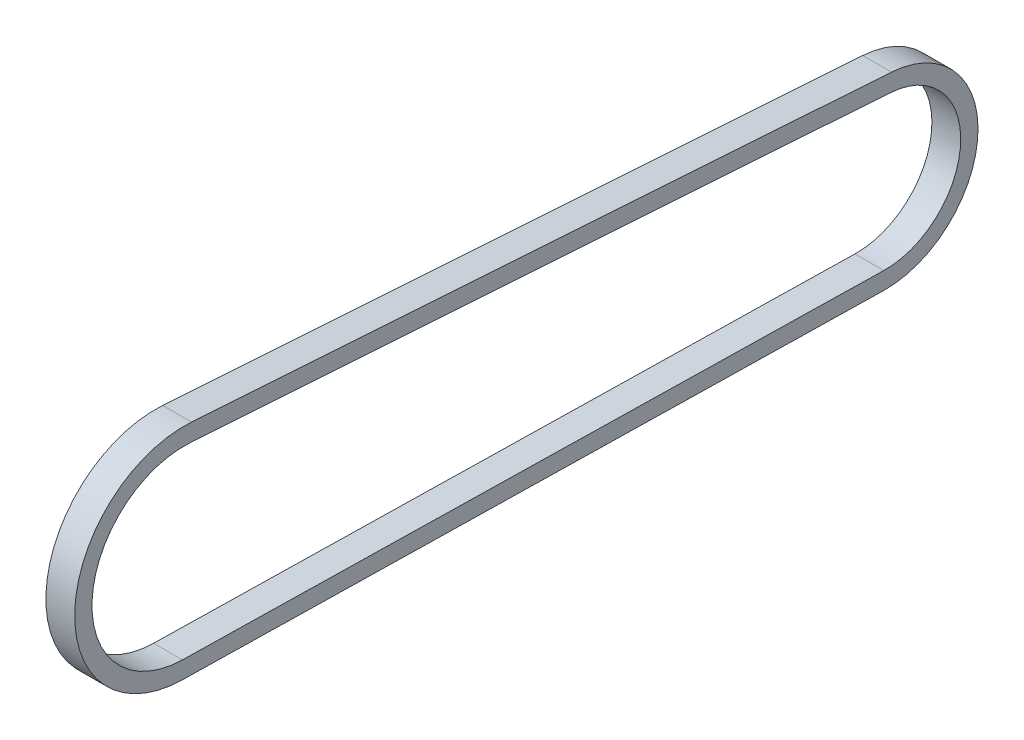
ISO-10303-21;
HEADER;
FILE_DESCRIPTION(('STEP AP214'),'2;1');
FILE_NAME('part.step','',(''),(''),'','','');
FILE_SCHEMA(('AUTOMOTIVE_DESIGN { 1 0 10303 214 1 1 1 1 }'));
ENDSEC;
DATA;
#1=APPLICATION_CONTEXT('core data for automotive mechanical design processes');
#2=APPLICATION_PROTOCOL_DEFINITION('international standard','automotive_design',2000,#1);
#3=PRODUCT_CONTEXT('',#1,'mechanical');
#4=PRODUCT('Part','Part','',(#3));
#5=PRODUCT_RELATED_PRODUCT_CATEGORY('part','',(#4));
#6=PRODUCT_DEFINITION_FORMATION('','',#4);
#7=PRODUCT_DEFINITION_CONTEXT('part definition',#1,'design');
#8=PRODUCT_DEFINITION('design','',#6,#7);
#9=PRODUCT_DEFINITION_SHAPE('','',#8);
#10=(LENGTH_UNIT() NAMED_UNIT(*) SI_UNIT(.MILLI.,.METRE.));
#11=(NAMED_UNIT(*) PLANE_ANGLE_UNIT() SI_UNIT($,.RADIAN.));
#12=(NAMED_UNIT(*) SI_UNIT($,.STERADIAN.) SOLID_ANGLE_UNIT());
#13=UNCERTAINTY_MEASURE_WITH_UNIT(LENGTH_MEASURE(1.E-05),#10,'distance_accuracy_value','');
#14=(GEOMETRIC_REPRESENTATION_CONTEXT(3) GLOBAL_UNCERTAINTY_ASSIGNED_CONTEXT((#13)) GLOBAL_UNIT_ASSIGNED_CONTEXT((#10,
#11,#12)) REPRESENTATION_CONTEXT('',''));
#15=CARTESIAN_POINT('',(0.,0.,0.));
#16=DIRECTION('',(0.,0.,1.));
#17=DIRECTION('',(1.,0.,0.));
#18=AXIS2_PLACEMENT_3D('',#15,#16,#17);
#19=CARTESIAN_POINT('',(68.5,21.,108.369459277537));
#20=DIRECTION('',(1.,0.,0.));
#21=DIRECTION('',(0.,0.,-1.));
#22=AXIS2_PLACEMENT_3D('',#19,#20,#21);
#23=PLANE('',#22);
#24=CARTESIAN_POINT('',(68.5,21.,108.369459277537));
#25=DIRECTION('',(1.,0.,0.));
#26=DIRECTION('',(0.,0.,-1.));
#27=AXIS2_PLACEMENT_3D('',#24,#25,#26);
#28=CIRCLE('',#27,15.204);
#29=CARTESIAN_POINT('',(68.5,36.169921825998,107.352066633024));
#30=VERTEX_POINT('',#29);
#31=CARTESIAN_POINT('',(68.5,5.79881685557827,108.662114381283));
#32=VERTEX_POINT('',#31);
#33=EDGE_CURVE('E140',#30,#32,#28,.T.);
#34=ORIENTED_EDGE('',*,*,#33,.T.);
#35=DIRECTION('',(0.,-0.019248559835972,-0.999814729309506));
#36=VECTOR('',#35,1.);
#37=CARTESIAN_POINT('',(68.5,5.79881685557827,108.662114381283));
#38=LINE('',#37,#36);
#39=CARTESIAN_POINT('',(68.5,3.92338610122288,11.2479022021275));
#40=VERTEX_POINT('',#39);
#41=EDGE_CURVE('E143',#32,#40,#38,.T.);
#42=ORIENTED_EDGE('',*,*,#41,.T.);
#43=CARTESIAN_POINT('',(68.5,16.8,11.));
#44=DIRECTION('',(1.,0.,0.));
#45=DIRECTION('',(0.,0.,-1.));
#46=AXIS2_PLACEMENT_3D('',#43,#44,#45);
#47=CIRCLE('',#46,12.879);
#48=CARTESIAN_POINT('',(68.5,29.6501330700492,10.1381873277634));
#49=VERTEX_POINT('',#48);
#50=EDGE_CURVE('E146',#40,#49,#47,.T.);
#51=ORIENTED_EDGE('',*,*,#50,.T.);
#52=DIRECTION('',(0.,0.0669161171082067,0.997758604709156));
#53=VECTOR('',#52,1.);
#54=CARTESIAN_POINT('',(68.5,29.6501330700492,10.1381873277634));
#55=LINE('',#54,#53);
#56=EDGE_CURVE('E148',#49,#30,#55,.T.);
#57=ORIENTED_EDGE('',*,*,#56,.T.);
#58=EDGE_LOOP('',(#34,#42,#51,#57));
#59=FACE_BOUND('',#58,.T.);
#60=DIRECTION('',(0.,-0.019248559835972,-0.999814729309506));
#61=VECTOR('',#60,1.);
#62=CARTESIAN_POINT('',(68.5,8.19837220592108,108.615917837677));
#63=LINE('',#62,#61);
#64=CARTESIAN_POINT('',(68.5,8.19837220592108,108.615917837677));
#65=VERTEX_POINT('',#64);
#66=CARTESIAN_POINT('',(68.5,6.32294145156569,11.2017056585211));
#67=VERTEX_POINT('',#66);
#68=EDGE_CURVE('E112',#65,#67,#63,.T.);
#69=ORIENTED_EDGE('',*,*,#68,.F.);
#70=CARTESIAN_POINT('',(68.5,21.,108.369459277537));
#71=DIRECTION('',(1.,0.,0.));
#72=DIRECTION('',(0.,0.,-1.));
#73=AXIS2_PLACEMENT_3D('',#70,#71,#72);
#74=CIRCLE('',#73,12.804);
#75=CARTESIAN_POINT('',(68.5,33.775301174696,107.512665314084));
#76=VERTEX_POINT('',#75);
#77=EDGE_CURVE('E104',#76,#65,#74,.T.);
#78=ORIENTED_EDGE('',*,*,#77,.F.);
#79=DIRECTION('',(0.,0.0669161171082067,0.997758604709156));
#80=VECTOR('',#79,1.);
#81=CARTESIAN_POINT('',(68.5,27.2555124187472,10.2987860088231));
#82=LINE('',#81,#80);
#83=CARTESIAN_POINT('',(68.5,27.2555124187472,10.2987860088231));
#84=VERTEX_POINT('',#83);
#85=EDGE_CURVE('E126',#84,#76,#82,.T.);
#86=ORIENTED_EDGE('',*,*,#85,.F.);
#87=CARTESIAN_POINT('',(68.5,16.8,11.));
#88=DIRECTION('',(1.,0.,0.));
#89=DIRECTION('',(0.,0.,-1.));
#90=AXIS2_PLACEMENT_3D('',#87,#88,#89);
#91=CIRCLE('',#90,10.479);
#92=EDGE_CURVE('E124',#67,#84,#91,.T.);
#93=ORIENTED_EDGE('',*,*,#92,.F.);
#94=EDGE_LOOP('',(#69,#78,#86,#93));
#95=FACE_BOUND('',#94,.T.);
#96=ADVANCED_FACE('F39',(#59,#95),#23,.T.);
#97=CARTESIAN_POINT('',(64.5,21.,108.369459277537));
#98=DIRECTION('',(1.,0.,0.));
#99=DIRECTION('',(0.,0.,-1.));
#100=AXIS2_PLACEMENT_3D('',#97,#98,#99);
#101=PLANE('',#100);
#102=CARTESIAN_POINT('',(64.5,21.,108.369459277537));
#103=DIRECTION('',(1.,0.,0.));
#104=DIRECTION('',(0.,0.,-1.));
#105=AXIS2_PLACEMENT_3D('',#102,#103,#104);
#106=CIRCLE('',#105,15.204);
#107=CARTESIAN_POINT('',(64.5,36.169921825998,107.352066633024));
#108=VERTEX_POINT('',#107);
#109=CARTESIAN_POINT('',(64.5,5.79881685557827,108.662114381283));
#110=VERTEX_POINT('',#109);
#111=EDGE_CURVE('E120',#108,#110,#106,.T.);
#112=ORIENTED_EDGE('',*,*,#111,.F.);
#113=DIRECTION('',(0.,0.0669161171082067,0.997758604709156));
#114=VECTOR('',#113,1.);
#115=CARTESIAN_POINT('',(64.5,29.6501330700492,10.1381873277634));
#116=LINE('',#115,#114);
#117=CARTESIAN_POINT('',(64.5,29.6501330700492,10.1381873277634));
#118=VERTEX_POINT('',#117);
#119=EDGE_CURVE('E144',#118,#108,#116,.T.);
#120=ORIENTED_EDGE('',*,*,#119,.F.);
#121=CARTESIAN_POINT('',(64.5,16.8,11.));
#122=DIRECTION('',(1.,0.,0.));
#123=DIRECTION('',(0.,0.,-1.));
#124=AXIS2_PLACEMENT_3D('',#121,#122,#123);
#125=CIRCLE('',#124,12.879);
#126=CARTESIAN_POINT('',(64.5,3.92338610122288,11.2479022021275));
#127=VERTEX_POINT('',#126);
#128=EDGE_CURVE('E155',#127,#118,#125,.T.);
#129=ORIENTED_EDGE('',*,*,#128,.F.);
#130=DIRECTION('',(0.,-0.019248559835972,-0.999814729309506));
#131=VECTOR('',#130,1.);
#132=CARTESIAN_POINT('',(64.5,5.79881685557827,108.662114381283));
#133=LINE('',#132,#131);
#134=EDGE_CURVE('E153',#110,#127,#133,.T.);
#135=ORIENTED_EDGE('',*,*,#134,.F.);
#136=EDGE_LOOP('',(#112,#120,#129,#135));
#137=FACE_BOUND('',#136,.T.);
#138=CARTESIAN_POINT('',(64.5,21.,108.369459277537));
#139=DIRECTION('',(1.,0.,0.));
#140=DIRECTION('',(0.,0.,-1.));
#141=AXIS2_PLACEMENT_3D('',#138,#139,#140);
#142=CIRCLE('',#141,12.804);
#143=CARTESIAN_POINT('',(64.5,33.775301174696,107.512665314084));
#144=VERTEX_POINT('',#143);
#145=CARTESIAN_POINT('',(64.5,8.19837220592108,108.615917837677));
#146=VERTEX_POINT('',#145);
#147=EDGE_CURVE('E62',#144,#146,#142,.T.);
#148=ORIENTED_EDGE('',*,*,#147,.T.);
#149=DIRECTION('',(0.,-0.019248559835972,-0.999814729309506));
#150=VECTOR('',#149,1.);
#151=CARTESIAN_POINT('',(64.5,8.19837220592108,108.615917837677));
#152=LINE('',#151,#150);
#153=CARTESIAN_POINT('',(64.5,6.32294145156569,11.2017056585211));
#154=VERTEX_POINT('',#153);
#155=EDGE_CURVE('E119',#146,#154,#152,.T.);
#156=ORIENTED_EDGE('',*,*,#155,.T.);
#157=CARTESIAN_POINT('',(64.5,16.8,11.));
#158=DIRECTION('',(1.,0.,0.));
#159=DIRECTION('',(0.,0.,-1.));
#160=AXIS2_PLACEMENT_3D('',#157,#158,#159);
#161=CIRCLE('',#160,10.479);
#162=CARTESIAN_POINT('',(64.5,27.2555124187472,10.2987860088231));
#163=VERTEX_POINT('',#162);
#164=EDGE_CURVE('E132',#154,#163,#161,.T.);
#165=ORIENTED_EDGE('',*,*,#164,.T.);
#166=DIRECTION('',(0.,0.0669161171082067,0.997758604709156));
#167=VECTOR('',#166,1.);
#168=CARTESIAN_POINT('',(64.5,27.2555124187472,10.2987860088231));
#169=LINE('',#168,#167);
#170=EDGE_CURVE('E113',#163,#144,#169,.T.);
#171=ORIENTED_EDGE('',*,*,#170,.T.);
#172=EDGE_LOOP('',(#148,#156,#165,#171));
#173=FACE_BOUND('',#172,.T.);
#174=ADVANCED_FACE('F173',(#137,#173),#101,.F.);
#175=CARTESIAN_POINT('',(68.5,21.,108.369459277537));
#176=DIRECTION('',(-1.,0.,0.));
#177=DIRECTION('',(0.,0.,1.));
#178=AXIS2_PLACEMENT_3D('',#175,#176,#177);
#179=CYLINDRICAL_SURFACE('',#178,15.204);
#180=ORIENTED_EDGE('',*,*,#111,.T.);
#181=DIRECTION('',(-1.,0.,0.));
#182=VECTOR('',#181,1.);
#183=CARTESIAN_POINT('',(68.5,5.79881685557827,108.662114381283));
#184=LINE('',#183,#182);
#185=EDGE_CURVE('E11',#32,#110,#184,.T.);
#186=ORIENTED_EDGE('',*,*,#185,.F.);
#187=ORIENTED_EDGE('',*,*,#33,.F.);
#188=DIRECTION('',(-1.,0.,0.));
#189=VECTOR('',#188,1.);
#190=CARTESIAN_POINT('',(68.5,36.169921825998,107.352066633024));
#191=LINE('',#190,#189);
#192=EDGE_CURVE('E150',#30,#108,#191,.T.);
#193=ORIENTED_EDGE('',*,*,#192,.T.);
#194=EDGE_LOOP('',(#180,#186,#187,#193));
#195=FACE_BOUND('',#194,.T.);
#196=ADVANCED_FACE('F41',(#195),#179,.T.);
#197=CARTESIAN_POINT('',(68.5,5.79881685557827,108.662114381283));
#198=DIRECTION('',(0.,0.999814729309506,-0.019248559835972));
#199=DIRECTION('',(0.,0.019248559835972,0.999814729309506));
#200=AXIS2_PLACEMENT_3D('',#197,#198,#199);
#201=PLANE('',#200);
#202=ORIENTED_EDGE('',*,*,#134,.T.);
#203=DIRECTION('',(-1.,0.,0.));
#204=VECTOR('',#203,1.);
#205=CARTESIAN_POINT('',(68.5,3.92338610122288,11.2479022021275));
#206=LINE('',#205,#204);
#207=EDGE_CURVE('E47',#40,#127,#206,.T.);
#208=ORIENTED_EDGE('',*,*,#207,.F.);
#209=ORIENTED_EDGE('',*,*,#41,.F.);
#210=ORIENTED_EDGE('',*,*,#185,.T.);
#211=EDGE_LOOP('',(#202,#208,#209,#210));
#212=FACE_BOUND('',#211,.T.);
#213=ADVANCED_FACE('F183',(#212),#201,.F.);
#214=CARTESIAN_POINT('',(68.5,16.8,11.));
#215=DIRECTION('',(-1.,0.,0.));
#216=DIRECTION('',(0.,0.,1.));
#217=AXIS2_PLACEMENT_3D('',#214,#215,#216);
#218=CYLINDRICAL_SURFACE('',#217,12.879);
#219=ORIENTED_EDGE('',*,*,#128,.T.);
#220=DIRECTION('',(-1.,0.,0.));
#221=VECTOR('',#220,1.);
#222=CARTESIAN_POINT('',(68.5,29.6501330700492,10.1381873277634));
#223=LINE('',#222,#221);
#224=EDGE_CURVE('E160',#49,#118,#223,.T.);
#225=ORIENTED_EDGE('',*,*,#224,.F.);
#226=ORIENTED_EDGE('',*,*,#50,.F.);
#227=ORIENTED_EDGE('',*,*,#207,.T.);
#228=EDGE_LOOP('',(#219,#225,#226,#227));
#229=FACE_BOUND('',#228,.T.);
#230=ADVANCED_FACE('F167',(#229),#218,.T.);
#231=CARTESIAN_POINT('',(68.5,29.6501330700492,10.1381873277634));
#232=DIRECTION('',(0.,-0.997758604709155,0.0669161171082067));
#233=DIRECTION('',(0.,-0.0669161171082067,-0.997758604709155));
#234=AXIS2_PLACEMENT_3D('',#231,#232,#233);
#235=PLANE('',#234);
#236=ORIENTED_EDGE('',*,*,#119,.T.);
#237=ORIENTED_EDGE('',*,*,#192,.F.);
#238=ORIENTED_EDGE('',*,*,#56,.F.);
#239=ORIENTED_EDGE('',*,*,#224,.T.);
#240=EDGE_LOOP('',(#236,#237,#238,#239));
#241=FACE_BOUND('',#240,.T.);
#242=ADVANCED_FACE('F177',(#241),#235,.F.);
#243=CARTESIAN_POINT('',(68.5,21.,108.369459277537));
#244=DIRECTION('',(-1.,0.,0.));
#245=DIRECTION('',(0.,0.,1.));
#246=AXIS2_PLACEMENT_3D('',#243,#244,#245);
#247=CYLINDRICAL_SURFACE('',#246,12.804);
#248=ORIENTED_EDGE('',*,*,#147,.F.);
#249=DIRECTION('',(-1.,0.,0.));
#250=VECTOR('',#249,1.);
#251=CARTESIAN_POINT('',(68.5,33.775301174696,107.512665314084));
#252=LINE('',#251,#250);
#253=EDGE_CURVE('E108',#76,#144,#252,.T.);
#254=ORIENTED_EDGE('',*,*,#253,.F.);
#255=ORIENTED_EDGE('',*,*,#77,.T.);
#256=DIRECTION('',(-1.,0.,0.));
#257=VECTOR('',#256,1.);
#258=CARTESIAN_POINT('',(68.5,8.19837220592108,108.615917837677));
#259=LINE('',#258,#257);
#260=EDGE_CURVE('E107',#65,#146,#259,.T.);
#261=ORIENTED_EDGE('',*,*,#260,.T.);
#262=EDGE_LOOP('',(#248,#254,#255,#261));
#263=FACE_BOUND('',#262,.T.);
#264=ADVANCED_FACE('F106',(#263),#247,.F.);
#265=CARTESIAN_POINT('',(68.5,8.19837220592108,108.615917837677));
#266=DIRECTION('',(0.,0.999814729309506,-0.019248559835972));
#267=DIRECTION('',(0.,0.019248559835972,0.999814729309506));
#268=AXIS2_PLACEMENT_3D('',#265,#266,#267);
#269=PLANE('',#268);
#270=ORIENTED_EDGE('',*,*,#155,.F.);
#271=ORIENTED_EDGE('',*,*,#260,.F.);
#272=ORIENTED_EDGE('',*,*,#68,.T.);
#273=DIRECTION('',(-1.,0.,0.));
#274=VECTOR('',#273,1.);
#275=CARTESIAN_POINT('',(68.5,6.32294145156569,11.2017056585211));
#276=LINE('',#275,#274);
#277=EDGE_CURVE('E121',#67,#154,#276,.T.);
#278=ORIENTED_EDGE('',*,*,#277,.T.);
#279=EDGE_LOOP('',(#270,#271,#272,#278));
#280=FACE_BOUND('',#279,.T.);
#281=ADVANCED_FACE('F116',(#280),#269,.T.);
#282=CARTESIAN_POINT('',(68.5,16.8,11.));
#283=DIRECTION('',(-1.,0.,0.));
#284=DIRECTION('',(0.,0.,1.));
#285=AXIS2_PLACEMENT_3D('',#282,#283,#284);
#286=CYLINDRICAL_SURFACE('',#285,10.479);
#287=ORIENTED_EDGE('',*,*,#164,.F.);
#288=ORIENTED_EDGE('',*,*,#277,.F.);
#289=ORIENTED_EDGE('',*,*,#92,.T.);
#290=DIRECTION('',(-1.,0.,0.));
#291=VECTOR('',#290,1.);
#292=CARTESIAN_POINT('',(68.5,27.2555124187472,10.2987860088231));
#293=LINE('',#292,#291);
#294=EDGE_CURVE('E54',#84,#163,#293,.T.);
#295=ORIENTED_EDGE('',*,*,#294,.T.);
#296=EDGE_LOOP('',(#287,#288,#289,#295));
#297=FACE_BOUND('',#296,.T.);
#298=ADVANCED_FACE('F210',(#297),#286,.F.);
#299=CARTESIAN_POINT('',(68.5,27.2555124187472,10.2987860088231));
#300=DIRECTION('',(0.,-0.997758604709155,0.0669161171082067));
#301=DIRECTION('',(0.,-0.0669161171082067,-0.997758604709155));
#302=AXIS2_PLACEMENT_3D('',#299,#300,#301);
#303=PLANE('',#302);
#304=ORIENTED_EDGE('',*,*,#170,.F.);
#305=ORIENTED_EDGE('',*,*,#294,.F.);
#306=ORIENTED_EDGE('',*,*,#85,.T.);
#307=ORIENTED_EDGE('',*,*,#253,.T.);
#308=EDGE_LOOP('',(#304,#305,#306,#307));
#309=FACE_BOUND('',#308,.T.);
#310=ADVANCED_FACE('F215',(#309),#303,.T.);
#311=CLOSED_SHELL('',(#96,#174,#196,#213,#230,#242,#264,#281,#298,#310));
#312=MANIFOLD_SOLID_BREP('B2',#311);
#313=ADVANCED_BREP_SHAPE_REPRESENTATION('',(#18,#312),#14);
#314=SHAPE_DEFINITION_REPRESENTATION(#9,#313);
ENDSEC;
END-ISO-10303-21;
